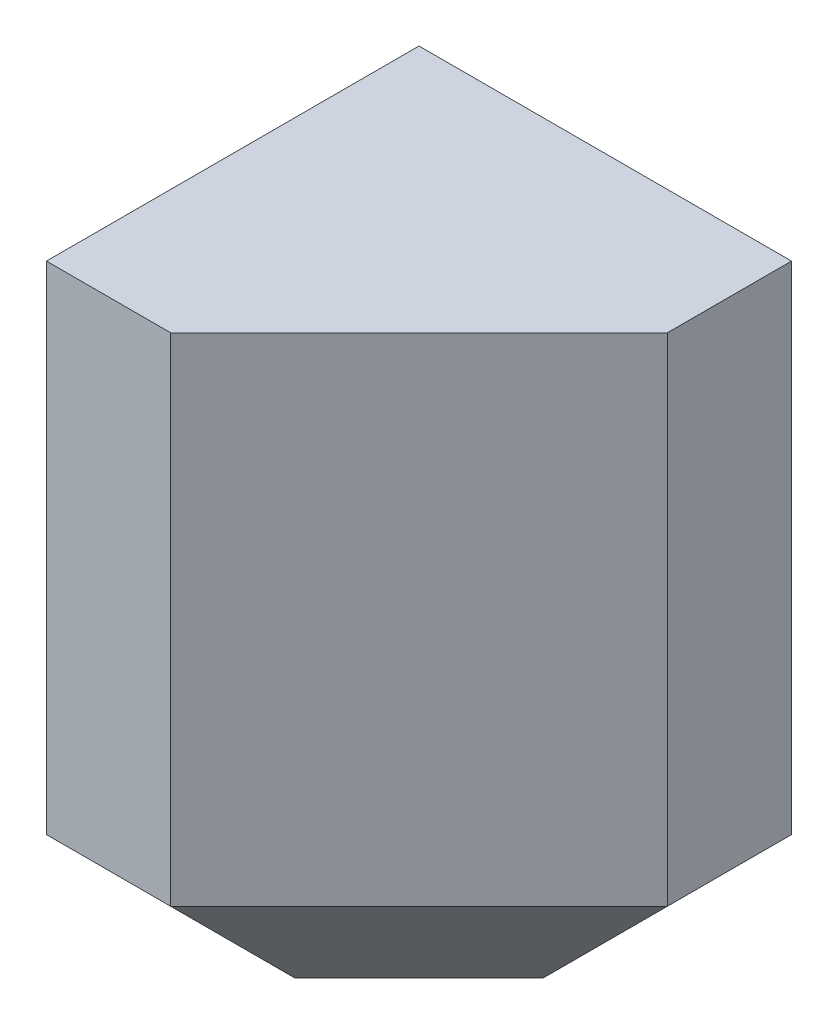
ISO-10303-21;
HEADER;
FILE_DESCRIPTION(('STEP AP214'),'2;1');
FILE_NAME('part.step','',(''),(''),'','','');
FILE_SCHEMA(('AUTOMOTIVE_DESIGN { 1 0 10303 214 1 1 1 1 }'));
ENDSEC;
DATA;
#1=APPLICATION_CONTEXT('core data for automotive mechanical design processes');
#2=APPLICATION_PROTOCOL_DEFINITION('international standard','automotive_design',2000,#1);
#3=PRODUCT_CONTEXT('',#1,'mechanical');
#4=PRODUCT('Part','Part','',(#3));
#5=PRODUCT_RELATED_PRODUCT_CATEGORY('part','',(#4));
#6=PRODUCT_DEFINITION_FORMATION('','',#4);
#7=PRODUCT_DEFINITION_CONTEXT('part definition',#1,'design');
#8=PRODUCT_DEFINITION('design','',#6,#7);
#9=PRODUCT_DEFINITION_SHAPE('','',#8);
#10=(LENGTH_UNIT() NAMED_UNIT(*) SI_UNIT(.MILLI.,.METRE.));
#11=(NAMED_UNIT(*) PLANE_ANGLE_UNIT() SI_UNIT($,.RADIAN.));
#12=(NAMED_UNIT(*) SI_UNIT($,.STERADIAN.) SOLID_ANGLE_UNIT());
#13=UNCERTAINTY_MEASURE_WITH_UNIT(LENGTH_MEASURE(1.E-05),#10,'distance_accuracy_value','');
#14=(GEOMETRIC_REPRESENTATION_CONTEXT(3) GLOBAL_UNCERTAINTY_ASSIGNED_CONTEXT((#13)) GLOBAL_UNIT_ASSIGNED_CONTEXT((#10,
#11,#12)) REPRESENTATION_CONTEXT('',''));
#15=CARTESIAN_POINT('',(0.,0.,0.));
#16=DIRECTION('',(0.,0.,1.));
#17=DIRECTION('',(1.,0.,0.));
#18=AXIS2_PLACEMENT_3D('',#15,#16,#17);
#19=CARTESIAN_POINT('',(0.,0.,30.));
#20=DIRECTION('',(1.,0.,0.));
#21=DIRECTION('',(0.,0.,-1.));
#22=AXIS2_PLACEMENT_3D('',#19,#20,#21);
#23=PLANE('',#22);
#24=CARTESIAN_POINT('',(0.,48.,18.));
#25=DIRECTION('',(-1.,0.,0.));
#26=DIRECTION('',(0.,0.,1.));
#27=AXIS2_PLACEMENT_3D('',#24,#25,#26);
#28=CIRCLE('',#27,2.75);
#29=CARTESIAN_POINT('',(0.,48.,20.75));
#30=VERTEX_POINT('',#29);
#31=EDGE_CURVE('E182',#30,#30,#28,.T.);
#32=ORIENTED_EDGE('',*,*,#31,.F.);
#33=EDGE_LOOP('',(#32));
#34=FACE_BOUND('',#33,.T.);
#35=CARTESIAN_POINT('',(0.,20.,18.));
#36=DIRECTION('',(-1.,0.,0.));
#37=DIRECTION('',(0.,0.,1.));
#38=AXIS2_PLACEMENT_3D('',#35,#36,#37);
#39=CIRCLE('',#38,2.74999999999999);
#40=CARTESIAN_POINT('',(0.,20.,20.75));
#41=VERTEX_POINT('',#40);
#42=EDGE_CURVE('E176',#41,#41,#39,.T.);
#43=ORIENTED_EDGE('',*,*,#42,.F.);
#44=EDGE_LOOP('',(#43));
#45=FACE_BOUND('',#44,.T.);
#46=DIRECTION('',(0.,0.,-1.));
#47=VECTOR('',#46,1.);
#48=CARTESIAN_POINT('',(0.,10.,30.));
#49=LINE('',#48,#47);
#50=CARTESIAN_POINT('',(0.,10.,20.));
#51=VERTEX_POINT('',#50);
#52=CARTESIAN_POINT('',(0.,10.,0.));
#53=VERTEX_POINT('',#52);
#54=EDGE_CURVE('E109',#51,#53,#49,.T.);
#55=ORIENTED_EDGE('',*,*,#54,.F.);
#56=DIRECTION('',(0.,-0.707106781186546,-0.707106781186549));
#57=VECTOR('',#56,1.);
#58=CARTESIAN_POINT('',(0.,20.,30.));
#59=LINE('',#58,#57);
#60=CARTESIAN_POINT('',(0.,20.,30.));
#61=VERTEX_POINT('',#60);
#62=EDGE_CURVE('E48',#51,#61,#59,.F.);
#63=ORIENTED_EDGE('',*,*,#62,.T.);
#64=DIRECTION('',(0.,-1.,0.));
#65=VECTOR('',#64,1.);
#66=CARTESIAN_POINT('',(0.,0.,30.));
#67=LINE('',#66,#65);
#68=CARTESIAN_POINT('',(0.,60.,30.));
#69=VERTEX_POINT('',#68);
#70=EDGE_CURVE('E134',#69,#61,#67,.T.);
#71=ORIENTED_EDGE('',*,*,#70,.F.);
#72=DIRECTION('',(0.,0.,1.));
#73=VECTOR('',#72,1.);
#74=CARTESIAN_POINT('',(0.,60.,30.));
#75=LINE('',#74,#73);
#76=CARTESIAN_POINT('',(0.,60.,0.));
#77=VERTEX_POINT('',#76);
#78=EDGE_CURVE('E131',#77,#69,#75,.T.);
#79=ORIENTED_EDGE('',*,*,#78,.F.);
#80=DIRECTION('',(0.,-1.,0.));
#81=VECTOR('',#80,1.);
#82=CARTESIAN_POINT('',(0.,0.,0.));
#83=LINE('',#82,#81);
#84=EDGE_CURVE('E123',#77,#53,#83,.T.);
#85=ORIENTED_EDGE('',*,*,#84,.T.);
#86=EDGE_LOOP('',(#55,#63,#71,#79,#85));
#87=FACE_BOUND('',#86,.T.);
#88=ADVANCED_FACE('F39',(#34,#45,#87),#23,.F.);
#89=CARTESIAN_POINT('',(0.,0.,0.));
#90=DIRECTION('',(0.,0.,-1.));
#91=DIRECTION('',(-1.,0.,0.));
#92=AXIS2_PLACEMENT_3D('',#89,#90,#91);
#93=PLANE('',#92);
#94=CARTESIAN_POINT('',(18.,20.,0.));
#95=DIRECTION('',(0.,0.,-1.));
#96=DIRECTION('',(-1.,0.,0.));
#97=AXIS2_PLACEMENT_3D('',#94,#95,#96);
#98=CIRCLE('',#97,2.74999999999999);
#99=CARTESIAN_POINT('',(15.25,20.,0.));
#100=VERTEX_POINT('',#99);
#101=EDGE_CURVE('E162',#100,#100,#98,.T.);
#102=ORIENTED_EDGE('',*,*,#101,.F.);
#103=EDGE_LOOP('',(#102));
#104=FACE_BOUND('',#103,.T.);
#105=CARTESIAN_POINT('',(18.,48.,0.));
#106=DIRECTION('',(0.,0.,-1.));
#107=DIRECTION('',(-1.,0.,0.));
#108=AXIS2_PLACEMENT_3D('',#105,#106,#107);
#109=CIRCLE('',#108,2.74999999999999);
#110=CARTESIAN_POINT('',(15.25,48.,0.));
#111=VERTEX_POINT('',#110);
#112=EDGE_CURVE('E170',#111,#111,#109,.T.);
#113=ORIENTED_EDGE('',*,*,#112,.F.);
#114=EDGE_LOOP('',(#113));
#115=FACE_BOUND('',#114,.T.);
#116=DIRECTION('',(0.707106781186549,0.707106781186546,0.));
#117=VECTOR('',#116,1.);
#118=CARTESIAN_POINT('',(4.99999999999996,-4.99999999999997,0.));
#119=LINE('',#118,#117);
#120=CARTESIAN_POINT('',(30.,20.,0.));
#121=VERTEX_POINT('',#120);
#122=CARTESIAN_POINT('',(20.,10.,0.));
#123=VERTEX_POINT('',#122);
#124=EDGE_CURVE('E127',#121,#123,#119,.F.);
#125=ORIENTED_EDGE('',*,*,#124,.T.);
#126=DIRECTION('',(1.,0.,0.));
#127=VECTOR('',#126,1.);
#128=CARTESIAN_POINT('',(0.,10.,0.));
#129=LINE('',#128,#127);
#130=EDGE_CURVE('E112',#53,#123,#129,.T.);
#131=ORIENTED_EDGE('',*,*,#130,.F.);
#132=ORIENTED_EDGE('',*,*,#84,.F.);
#133=DIRECTION('',(-1.,0.,0.));
#134=VECTOR('',#133,1.);
#135=CARTESIAN_POINT('',(0.,60.,0.));
#136=LINE('',#135,#134);
#137=CARTESIAN_POINT('',(30.,60.,0.));
#138=VERTEX_POINT('',#137);
#139=EDGE_CURVE('E153',#138,#77,#136,.T.);
#140=ORIENTED_EDGE('',*,*,#139,.F.);
#141=DIRECTION('',(0.,1.,0.));
#142=VECTOR('',#141,1.);
#143=CARTESIAN_POINT('',(30.,0.,0.));
#144=LINE('',#143,#142);
#145=EDGE_CURVE('E132',#121,#138,#144,.T.);
#146=ORIENTED_EDGE('',*,*,#145,.F.);
#147=EDGE_LOOP('',(#125,#131,#132,#140,#146));
#148=FACE_BOUND('',#147,.T.);
#149=ADVANCED_FACE('F121',(#104,#115,#148),#93,.T.);
#150=CARTESIAN_POINT('',(30.,20.,30.));
#151=DIRECTION('',(-0.707106781186546,0.707106781186549,0.));
#152=DIRECTION('',(0.,0.,-1.));
#153=AXIS2_PLACEMENT_3D('',#150,#151,#152);
#154=PLANE('',#153);
#155=DIRECTION('',(-0.707106781186549,-0.707106781186546,0.));
#156=VECTOR('',#155,1.);
#157=CARTESIAN_POINT('',(30.,20.,9.99999999999995));
#158=LINE('',#157,#156);
#159=CARTESIAN_POINT('',(20.,10.,9.99999999999995));
#160=VERTEX_POINT('',#159);
#161=CARTESIAN_POINT('',(30.,20.,9.99999999999995));
#162=VERTEX_POINT('',#161);
#163=EDGE_CURVE('E61',#160,#162,#158,.F.);
#164=ORIENTED_EDGE('',*,*,#163,.F.);
#165=DIRECTION('',(0.,0.,1.));
#166=VECTOR('',#165,1.);
#167=CARTESIAN_POINT('',(20.,10.,30.));
#168=LINE('',#167,#166);
#169=EDGE_CURVE('E55',#160,#123,#168,.F.);
#170=ORIENTED_EDGE('',*,*,#169,.T.);
#171=ORIENTED_EDGE('',*,*,#124,.F.);
#172=DIRECTION('',(0.,0.,-1.));
#173=VECTOR('',#172,1.);
#174=CARTESIAN_POINT('',(30.,20.,30.));
#175=LINE('',#174,#173);
#176=EDGE_CURVE('E144',#162,#121,#175,.T.);
#177=ORIENTED_EDGE('',*,*,#176,.F.);
#178=EDGE_LOOP('',(#164,#170,#171,#177));
#179=FACE_BOUND('',#178,.T.);
#180=ADVANCED_FACE('F42',(#179),#154,.F.);
#181=CARTESIAN_POINT('',(0.,20.,30.));
#182=DIRECTION('',(0.,0.707106781186549,-0.707106781186546));
#183=DIRECTION('',(1.,0.,0.));
#184=AXIS2_PLACEMENT_3D('',#181,#182,#183);
#185=PLANE('',#184);
#186=ORIENTED_EDGE('',*,*,#62,.F.);
#187=DIRECTION('',(-1.,0.,0.));
#188=VECTOR('',#187,1.);
#189=CARTESIAN_POINT('',(0.,10.,20.));
#190=LINE('',#189,#188);
#191=CARTESIAN_POINT('',(9.99999999999995,10.,20.));
#192=VERTEX_POINT('',#191);
#193=EDGE_CURVE('E114',#51,#192,#190,.F.);
#194=ORIENTED_EDGE('',*,*,#193,.T.);
#195=DIRECTION('',(0.,0.707106781186546,0.707106781186549));
#196=VECTOR('',#195,1.);
#197=CARTESIAN_POINT('',(9.99999999999998,10.,20.));
#198=LINE('',#197,#196);
#199=CARTESIAN_POINT('',(10.,20.,30.));
#200=VERTEX_POINT('',#199);
#201=EDGE_CURVE('E136',#200,#192,#198,.F.);
#202=ORIENTED_EDGE('',*,*,#201,.F.);
#203=DIRECTION('',(1.,0.,0.));
#204=VECTOR('',#203,1.);
#205=CARTESIAN_POINT('',(0.,20.,30.));
#206=LINE('',#205,#204);
#207=EDGE_CURVE('E140',#61,#200,#206,.T.);
#208=ORIENTED_EDGE('',*,*,#207,.F.);
#209=EDGE_LOOP('',(#186,#194,#202,#208));
#210=FACE_BOUND('',#209,.T.);
#211=ADVANCED_FACE('F160',(#210),#185,.F.);
#212=CARTESIAN_POINT('',(30.,20.,9.99999999999995));
#213=DIRECTION('',(0.577350269189626,-0.577350269189628,0.577350269189624));
#214=DIRECTION('',(0.707106781186549,0.707106781186546,0.));
#215=AXIS2_PLACEMENT_3D('',#212,#213,#214);
#216=PLANE('',#215);
#217=ORIENTED_EDGE('',*,*,#201,.T.);
#218=DIRECTION('',(0.707106781186546,0.,-0.707106781186549));
#219=VECTOR('',#218,1.);
#220=CARTESIAN_POINT('',(25.,10.,4.99999999999994));
#221=LINE('',#220,#219);
#222=EDGE_CURVE('E11',#192,#160,#221,.T.);
#223=ORIENTED_EDGE('',*,*,#222,.T.);
#224=ORIENTED_EDGE('',*,*,#163,.T.);
#225=DIRECTION('',(0.707106781186546,0.,-0.707106781186549));
#226=VECTOR('',#225,1.);
#227=CARTESIAN_POINT('',(30.,20.,9.99999999999995));
#228=LINE('',#227,#226);
#229=EDGE_CURVE('E150',#200,#162,#228,.T.);
#230=ORIENTED_EDGE('',*,*,#229,.F.);
#231=EDGE_LOOP('',(#217,#223,#224,#230));
#232=FACE_BOUND('',#231,.T.);
#233=ADVANCED_FACE('F156',(#232),#216,.T.);
#234=CARTESIAN_POINT('',(30.,0.,30.));
#235=DIRECTION('',(-1.,0.,0.));
#236=DIRECTION('',(0.,0.,1.));
#237=AXIS2_PLACEMENT_3D('',#234,#235,#236);
#238=PLANE('',#237);
#239=ORIENTED_EDGE('',*,*,#145,.T.);
#240=DIRECTION('',(0.,0.,-1.));
#241=VECTOR('',#240,1.);
#242=CARTESIAN_POINT('',(30.,60.,0.));
#243=LINE('',#242,#241);
#244=CARTESIAN_POINT('',(30.,60.,9.99999999999992));
#245=VERTEX_POINT('',#244);
#246=EDGE_CURVE('E195',#245,#138,#243,.T.);
#247=ORIENTED_EDGE('',*,*,#246,.F.);
#248=DIRECTION('',(0.,-1.,0.));
#249=VECTOR('',#248,1.);
#250=CARTESIAN_POINT('',(30.,0.,9.99999999999995));
#251=LINE('',#250,#249);
#252=EDGE_CURVE('E146',#245,#162,#251,.T.);
#253=ORIENTED_EDGE('',*,*,#252,.T.);
#254=ORIENTED_EDGE('',*,*,#176,.T.);
#255=EDGE_LOOP('',(#239,#247,#253,#254));
#256=FACE_BOUND('',#255,.T.);
#257=ADVANCED_FACE('F210',(#256),#238,.F.);
#258=CARTESIAN_POINT('',(0.,0.,30.));
#259=DIRECTION('',(0.,0.,-1.));
#260=DIRECTION('',(-1.,0.,0.));
#261=AXIS2_PLACEMENT_3D('',#258,#259,#260);
#262=PLANE('',#261);
#263=ORIENTED_EDGE('',*,*,#207,.T.);
#264=DIRECTION('',(0.,1.,0.));
#265=VECTOR('',#264,1.);
#266=CARTESIAN_POINT('',(10.,0.,30.));
#267=LINE('',#266,#265);
#268=CARTESIAN_POINT('',(9.99999999999999,60.,30.));
#269=VERTEX_POINT('',#268);
#270=EDGE_CURVE('E142',#200,#269,#267,.T.);
#271=ORIENTED_EDGE('',*,*,#270,.T.);
#272=DIRECTION('',(1.,0.,0.));
#273=VECTOR('',#272,1.);
#274=CARTESIAN_POINT('',(9.99999999999999,60.,30.));
#275=LINE('',#274,#273);
#276=EDGE_CURVE('E189',#69,#269,#275,.T.);
#277=ORIENTED_EDGE('',*,*,#276,.F.);
#278=ORIENTED_EDGE('',*,*,#70,.T.);
#279=EDGE_LOOP('',(#263,#271,#277,#278));
#280=FACE_BOUND('',#279,.T.);
#281=ADVANCED_FACE('F208',(#280),#262,.F.);
#282=CARTESIAN_POINT('',(10.,0.,30.));
#283=DIRECTION('',(-0.707106781186549,0.,-0.707106781186546));
#284=DIRECTION('',(0.,1.,0.));
#285=AXIS2_PLACEMENT_3D('',#282,#283,#284);
#286=PLANE('',#285);
#287=ORIENTED_EDGE('',*,*,#229,.T.);
#288=ORIENTED_EDGE('',*,*,#252,.F.);
#289=DIRECTION('',(0.707106781186546,0.,-0.707106781186549));
#290=VECTOR('',#289,1.);
#291=CARTESIAN_POINT('',(30.,60.,9.99999999999992));
#292=LINE('',#291,#290);
#293=EDGE_CURVE('E192',#269,#245,#292,.T.);
#294=ORIENTED_EDGE('',*,*,#293,.F.);
#295=ORIENTED_EDGE('',*,*,#270,.F.);
#296=EDGE_LOOP('',(#287,#288,#294,#295));
#297=FACE_BOUND('',#296,.T.);
#298=ADVANCED_FACE('F204',(#297),#286,.F.);
#299=CARTESIAN_POINT('',(0.,60.,0.));
#300=DIRECTION('',(0.,-1.,0.));
#301=DIRECTION('',(0.,0.,-1.));
#302=AXIS2_PLACEMENT_3D('',#299,#300,#301);
#303=PLANE('',#302);
#304=ORIENTED_EDGE('',*,*,#78,.T.);
#305=ORIENTED_EDGE('',*,*,#276,.T.);
#306=ORIENTED_EDGE('',*,*,#293,.T.);
#307=ORIENTED_EDGE('',*,*,#246,.T.);
#308=ORIENTED_EDGE('',*,*,#139,.T.);
#309=EDGE_LOOP('',(#304,#305,#306,#307,#308));
#310=FACE_BOUND('',#309,.T.);
#311=ADVANCED_FACE('F198',(#310),#303,.F.);
#312=CARTESIAN_POINT('',(13.,48.,18.));
#313=DIRECTION('',(-1.,0.,0.));
#314=DIRECTION('',(0.,0.,1.));
#315=AXIS2_PLACEMENT_3D('',#312,#313,#314);
#316=CONICAL_SURFACE('',#315,2.75,1.02974425867665);
#317=CARTESIAN_POINT('',(14.6523667023258,48.,18.));
#318=VERTEX_POINT('',#317);
#319=VERTEX_LOOP('',#318);
#320=FACE_BOUND('',#319,.T.);
#321=CARTESIAN_POINT('',(13.,48.,18.));
#322=DIRECTION('',(-1.,0.,0.));
#323=DIRECTION('',(0.,0.,1.));
#324=AXIS2_PLACEMENT_3D('',#321,#322,#323);
#325=CIRCLE('',#324,2.75);
#326=CARTESIAN_POINT('',(13.,48.,20.75));
#327=VERTEX_POINT('',#326);
#328=EDGE_CURVE('E185',#327,#327,#325,.T.);
#329=ORIENTED_EDGE('',*,*,#328,.T.);
#330=EDGE_LOOP('',(#329));
#331=FACE_BOUND('',#330,.T.);
#332=ADVANCED_FACE('F333',(#320,#331),#316,.F.);
#333=CARTESIAN_POINT('',(0.,48.,18.));
#334=DIRECTION('',(-1.,0.,0.));
#335=DIRECTION('',(0.,0.,1.));
#336=AXIS2_PLACEMENT_3D('',#333,#334,#335);
#337=CYLINDRICAL_SURFACE('',#336,2.75);
#338=ORIENTED_EDGE('',*,*,#328,.F.);
#339=EDGE_LOOP('',(#338));
#340=FACE_BOUND('',#339,.T.);
#341=ORIENTED_EDGE('',*,*,#31,.T.);
#342=EDGE_LOOP('',(#341));
#343=FACE_BOUND('',#342,.T.);
#344=ADVANCED_FACE('F322',(#340,#343),#337,.F.);
#345=CARTESIAN_POINT('',(13.,20.,18.));
#346=DIRECTION('',(-1.,0.,0.));
#347=DIRECTION('',(0.,0.,1.));
#348=AXIS2_PLACEMENT_3D('',#345,#346,#347);
#349=CONICAL_SURFACE('',#348,2.75,1.02974425867665);
#350=CARTESIAN_POINT('',(14.6523667023258,20.,18.));
#351=VERTEX_POINT('',#350);
#352=VERTEX_LOOP('',#351);
#353=FACE_BOUND('',#352,.T.);
#354=CARTESIAN_POINT('',(13.,20.,18.));
#355=DIRECTION('',(-1.,0.,0.));
#356=DIRECTION('',(0.,0.,1.));
#357=AXIS2_PLACEMENT_3D('',#354,#355,#356);
#358=CIRCLE('',#357,2.75);
#359=CARTESIAN_POINT('',(13.,20.,20.75));
#360=VERTEX_POINT('',#359);
#361=EDGE_CURVE('E179',#360,#360,#358,.T.);
#362=ORIENTED_EDGE('',*,*,#361,.T.);
#363=EDGE_LOOP('',(#362));
#364=FACE_BOUND('',#363,.T.);
#365=ADVANCED_FACE('F311',(#353,#364),#349,.F.);
#366=CARTESIAN_POINT('',(0.,20.,18.));
#367=DIRECTION('',(-1.,0.,0.));
#368=DIRECTION('',(0.,0.,1.));
#369=AXIS2_PLACEMENT_3D('',#366,#367,#368);
#370=CYLINDRICAL_SURFACE('',#369,2.74999999999999);
#371=ORIENTED_EDGE('',*,*,#361,.F.);
#372=EDGE_LOOP('',(#371));
#373=FACE_BOUND('',#372,.T.);
#374=ORIENTED_EDGE('',*,*,#42,.T.);
#375=EDGE_LOOP('',(#374));
#376=FACE_BOUND('',#375,.T.);
#377=ADVANCED_FACE('F300',(#373,#376),#370,.F.);
#378=CARTESIAN_POINT('',(18.,48.,13.));
#379=DIRECTION('',(0.,0.,-1.));
#380=DIRECTION('',(-1.,0.,0.));
#381=AXIS2_PLACEMENT_3D('',#378,#379,#380);
#382=CONICAL_SURFACE('',#381,2.75,1.02974425867665);
#383=CARTESIAN_POINT('',(18.,48.,14.6523667023258));
#384=VERTEX_POINT('',#383);
#385=VERTEX_LOOP('',#384);
#386=FACE_BOUND('',#385,.T.);
#387=CARTESIAN_POINT('',(18.,48.,13.));
#388=DIRECTION('',(0.,0.,-1.));
#389=DIRECTION('',(-1.,0.,0.));
#390=AXIS2_PLACEMENT_3D('',#387,#388,#389);
#391=CIRCLE('',#390,2.75);
#392=CARTESIAN_POINT('',(15.25,48.,13.));
#393=VERTEX_POINT('',#392);
#394=EDGE_CURVE('E173',#393,#393,#391,.T.);
#395=ORIENTED_EDGE('',*,*,#394,.T.);
#396=EDGE_LOOP('',(#395));
#397=FACE_BOUND('',#396,.T.);
#398=ADVANCED_FACE('F289',(#386,#397),#382,.F.);
#399=CARTESIAN_POINT('',(18.,48.,0.));
#400=DIRECTION('',(0.,0.,-1.));
#401=DIRECTION('',(-1.,0.,0.));
#402=AXIS2_PLACEMENT_3D('',#399,#400,#401);
#403=CYLINDRICAL_SURFACE('',#402,2.74999999999999);
#404=ORIENTED_EDGE('',*,*,#394,.F.);
#405=EDGE_LOOP('',(#404));
#406=FACE_BOUND('',#405,.T.);
#407=ORIENTED_EDGE('',*,*,#112,.T.);
#408=EDGE_LOOP('',(#407));
#409=FACE_BOUND('',#408,.T.);
#410=ADVANCED_FACE('F278',(#406,#409),#403,.F.);
#411=CARTESIAN_POINT('',(18.,20.,13.));
#412=DIRECTION('',(0.,0.,-1.));
#413=DIRECTION('',(-1.,0.,0.));
#414=AXIS2_PLACEMENT_3D('',#411,#412,#413);
#415=CONICAL_SURFACE('',#414,2.75,1.02974425867665);
#416=CARTESIAN_POINT('',(18.,20.,14.6523667023258));
#417=VERTEX_POINT('',#416);
#418=VERTEX_LOOP('',#417);
#419=FACE_BOUND('',#418,.T.);
#420=CARTESIAN_POINT('',(18.,20.,13.));
#421=DIRECTION('',(0.,0.,-1.));
#422=DIRECTION('',(-1.,0.,0.));
#423=AXIS2_PLACEMENT_3D('',#420,#421,#422);
#424=CIRCLE('',#423,2.75);
#425=CARTESIAN_POINT('',(15.25,20.,13.));
#426=VERTEX_POINT('',#425);
#427=EDGE_CURVE('E167',#426,#426,#424,.T.);
#428=ORIENTED_EDGE('',*,*,#427,.T.);
#429=EDGE_LOOP('',(#428));
#430=FACE_BOUND('',#429,.T.);
#431=ADVANCED_FACE('F265',(#419,#430),#415,.F.);
#432=CARTESIAN_POINT('',(18.,20.,0.));
#433=DIRECTION('',(0.,0.,-1.));
#434=DIRECTION('',(-1.,0.,0.));
#435=AXIS2_PLACEMENT_3D('',#432,#433,#434);
#436=CYLINDRICAL_SURFACE('',#435,2.74999999999999);
#437=ORIENTED_EDGE('',*,*,#427,.F.);
#438=EDGE_LOOP('',(#437));
#439=FACE_BOUND('',#438,.T.);
#440=ORIENTED_EDGE('',*,*,#101,.T.);
#441=EDGE_LOOP('',(#440));
#442=FACE_BOUND('',#441,.T.);
#443=ADVANCED_FACE('F260',(#439,#442),#436,.F.);
#444=CARTESIAN_POINT('',(0.,10.,0.));
#445=DIRECTION('',(0.,-1.,0.));
#446=DIRECTION('',(0.,0.,-1.));
#447=AXIS2_PLACEMENT_3D('',#444,#445,#446);
#448=PLANE('',#447);
#449=ORIENTED_EDGE('',*,*,#222,.F.);
#450=ORIENTED_EDGE('',*,*,#193,.F.);
#451=ORIENTED_EDGE('',*,*,#54,.T.);
#452=ORIENTED_EDGE('',*,*,#130,.T.);
#453=ORIENTED_EDGE('',*,*,#169,.F.);
#454=EDGE_LOOP('',(#449,#450,#451,#452,#453));
#455=FACE_BOUND('',#454,.T.);
#456=ADVANCED_FACE('F111',(#455),#448,.T.);
#457=CLOSED_SHELL('',(#88,#149,#180,#211,#233,#257,#281,#298,#311,#332,#344,#365,#377,#398,#410,
#431,#443,#456));
#458=MANIFOLD_SOLID_BREP('B2',#457);
#459=ADVANCED_BREP_SHAPE_REPRESENTATION('',(#18,#458),#14);
#460=SHAPE_DEFINITION_REPRESENTATION(#9,#459);
ENDSEC;
END-ISO-10303-21;
